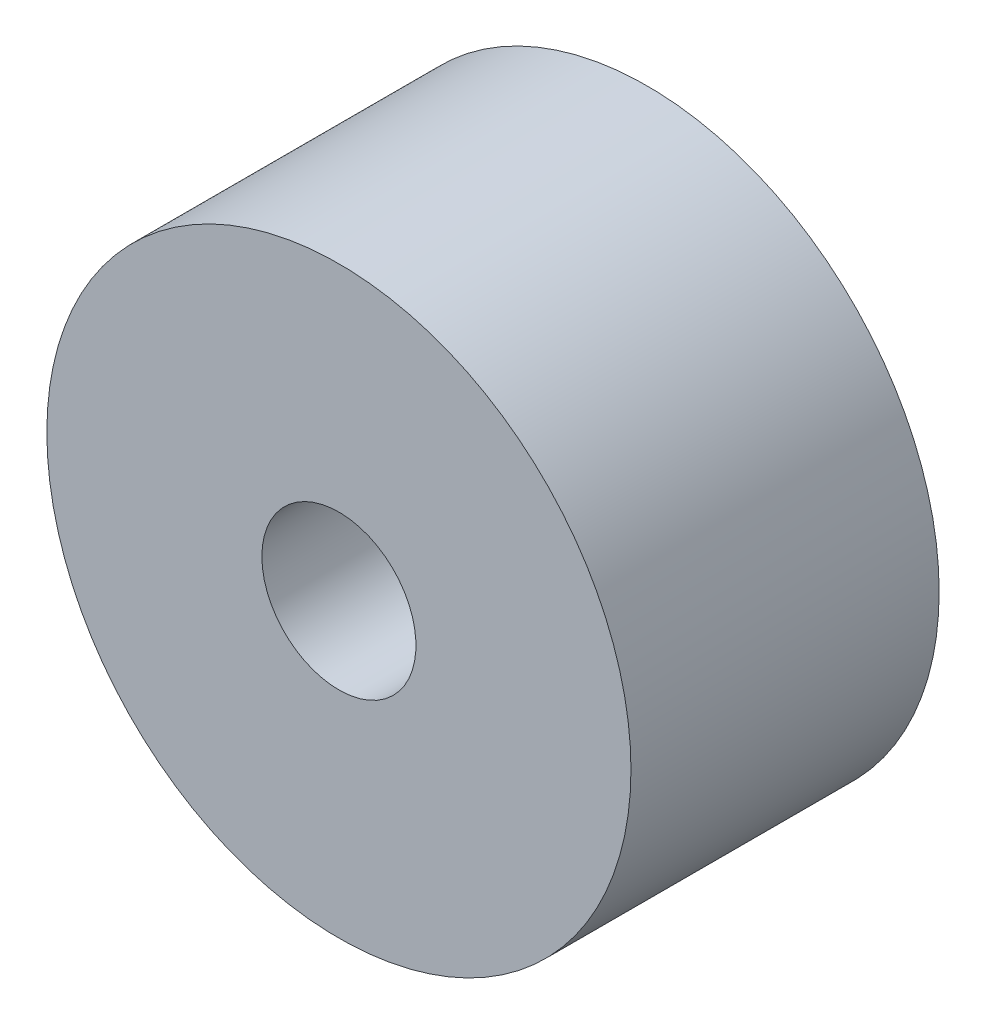
ISO-10303-21;
HEADER;
FILE_DESCRIPTION(('STEP AP214'),'2;1');
FILE_NAME('part.step','',(''),(''),'','','');
FILE_SCHEMA(('AUTOMOTIVE_DESIGN { 1 0 10303 214 1 1 1 1 }'));
ENDSEC;
DATA;
#1=APPLICATION_CONTEXT('core data for automotive mechanical design processes');
#2=APPLICATION_PROTOCOL_DEFINITION('international standard','automotive_design',2000,#1);
#3=PRODUCT_CONTEXT('',#1,'mechanical');
#4=PRODUCT('Part','Part','',(#3));
#5=PRODUCT_RELATED_PRODUCT_CATEGORY('part','',(#4));
#6=PRODUCT_DEFINITION_FORMATION('','',#4);
#7=PRODUCT_DEFINITION_CONTEXT('part definition',#1,'design');
#8=PRODUCT_DEFINITION('design','',#6,#7);
#9=PRODUCT_DEFINITION_SHAPE('','',#8);
#10=(LENGTH_UNIT() NAMED_UNIT(*) SI_UNIT(.MILLI.,.METRE.));
#11=(NAMED_UNIT(*) PLANE_ANGLE_UNIT() SI_UNIT($,.RADIAN.));
#12=(NAMED_UNIT(*) SI_UNIT($,.STERADIAN.) SOLID_ANGLE_UNIT());
#13=UNCERTAINTY_MEASURE_WITH_UNIT(LENGTH_MEASURE(1.E-05),#10,'distance_accuracy_value','');
#14=(GEOMETRIC_REPRESENTATION_CONTEXT(3) GLOBAL_UNCERTAINTY_ASSIGNED_CONTEXT((#13)) GLOBAL_UNIT_ASSIGNED_CONTEXT((#10,
#11,#12)) REPRESENTATION_CONTEXT('',''));
#15=CARTESIAN_POINT('',(0.,0.,0.));
#16=DIRECTION('',(0.,0.,1.));
#17=DIRECTION('',(1.,0.,0.));
#18=AXIS2_PLACEMENT_3D('',#15,#16,#17);
#19=CARTESIAN_POINT('',(0.,0.,0.));
#20=DIRECTION('',(0.,0.,1.));
#21=DIRECTION('',(1.,0.,0.));
#22=AXIS2_PLACEMENT_3D('',#19,#20,#21);
#23=PLANE('',#22);
#24=CARTESIAN_POINT('',(0.,0.,0.));
#25=DIRECTION('',(0.,0.,1.));
#26=DIRECTION('',(1.,0.,0.));
#27=AXIS2_PLACEMENT_3D('',#24,#25,#26);
#28=CIRCLE('',#27,4.64999999999999);
#29=CARTESIAN_POINT('',(4.64999999999999,0.,0.));
#30=VERTEX_POINT('',#29);
#31=EDGE_CURVE('E10',#30,#30,#28,.T.);
#32=ORIENTED_EDGE('',*,*,#31,.T.);
#33=EDGE_LOOP('',(#32));
#34=FACE_BOUND('',#33,.T.);
#35=CARTESIAN_POINT('',(0.,0.,0.));
#36=DIRECTION('',(0.,0.,1.));
#37=DIRECTION('',(1.,0.,0.));
#38=AXIS2_PLACEMENT_3D('',#35,#36,#37);
#39=CIRCLE('',#38,8.15);
#40=CARTESIAN_POINT('',(-8.15,0.,0.));
#41=VERTEX_POINT('',#40);
#42=EDGE_CURVE('E44',#41,#41,#39,.T.);
#43=ORIENTED_EDGE('',*,*,#42,.F.);
#44=EDGE_LOOP('',(#43));
#45=FACE_BOUND('',#44,.T.);
#46=ADVANCED_FACE('F32',(#34,#45),#23,.F.);
#47=CARTESIAN_POINT('',(0.,0.,8.6));
#48=DIRECTION('',(0.,0.,1.));
#49=DIRECTION('',(1.,0.,0.));
#50=AXIS2_PLACEMENT_3D('',#47,#48,#49);
#51=PLANE('',#50);
#52=CARTESIAN_POINT('',(0.,0.,8.6));
#53=DIRECTION('',(0.,0.,1.));
#54=DIRECTION('',(1.,0.,0.));
#55=AXIS2_PLACEMENT_3D('',#52,#53,#54);
#56=CIRCLE('',#55,8.15);
#57=CARTESIAN_POINT('',(-8.15,0.,8.6));
#58=VERTEX_POINT('',#57);
#59=EDGE_CURVE('E40',#58,#58,#56,.T.);
#60=ORIENTED_EDGE('',*,*,#59,.T.);
#61=EDGE_LOOP('',(#60));
#62=FACE_BOUND('',#61,.T.);
#63=CARTESIAN_POINT('',(0.,0.,8.6));
#64=DIRECTION('',(0.,0.,1.));
#65=DIRECTION('',(1.,0.,0.));
#66=AXIS2_PLACEMENT_3D('',#63,#64,#65);
#67=CIRCLE('',#66,2.15);
#68=CARTESIAN_POINT('',(-2.15,0.,8.6));
#69=VERTEX_POINT('',#68);
#70=EDGE_CURVE('E49',#69,#69,#67,.T.);
#71=ORIENTED_EDGE('',*,*,#70,.F.);
#72=EDGE_LOOP('',(#71));
#73=FACE_BOUND('',#72,.T.);
#74=ADVANCED_FACE('F75',(#62,#73),#51,.T.);
#75=CARTESIAN_POINT('',(0.,0.,8.6));
#76=DIRECTION('',(0.,0.,-1.));
#77=DIRECTION('',(-1.,0.,0.));
#78=AXIS2_PLACEMENT_3D('',#75,#76,#77);
#79=CYLINDRICAL_SURFACE('',#78,8.15);
#80=CARTESIAN_POINT('',(-8.15,0.,8.6));
#81=CARTESIAN_POINT('',(-8.15,0.,8.51041666666666));
#82=CARTESIAN_POINT('',(-8.15,0.,8.42083333333333));
#83=CARTESIAN_POINT('',(-8.15,0.,8.24166666666667));
#84=CARTESIAN_POINT('',(-8.15,0.,8.15208333333333));
#85=CARTESIAN_POINT('',(-8.15,0.,7.97291666666667));
#86=CARTESIAN_POINT('',(-8.15,0.,7.88333333333333));
#87=CARTESIAN_POINT('',(-8.15,0.,7.70416666666667));
#88=CARTESIAN_POINT('',(-8.15,0.,7.61458333333333));
#89=CARTESIAN_POINT('',(-8.15,0.,7.43541666666667));
#90=CARTESIAN_POINT('',(-8.15,0.,7.34583333333333));
#91=CARTESIAN_POINT('',(-8.15,0.,7.16666666666667));
#92=CARTESIAN_POINT('',(-8.15,0.,7.07708333333333));
#93=CARTESIAN_POINT('',(-8.15,0.,6.89791666666667));
#94=CARTESIAN_POINT('',(-8.15,0.,6.80833333333333));
#95=CARTESIAN_POINT('',(-8.15,0.,6.62916666666667));
#96=CARTESIAN_POINT('',(-8.15,0.,6.53958333333333));
#97=CARTESIAN_POINT('',(-8.15,0.,6.36041666666667));
#98=CARTESIAN_POINT('',(-8.15,0.,6.27083333333333));
#99=CARTESIAN_POINT('',(-8.15,0.,6.09166666666667));
#100=CARTESIAN_POINT('',(-8.15,0.,6.00208333333333));
#101=CARTESIAN_POINT('',(-8.15,0.,5.82291666666667));
#102=CARTESIAN_POINT('',(-8.15,0.,5.73333333333333));
#103=CARTESIAN_POINT('',(-8.15,0.,5.55416666666667));
#104=CARTESIAN_POINT('',(-8.15,0.,5.46458333333333));
#105=CARTESIAN_POINT('',(-8.15,0.,5.28541666666667));
#106=CARTESIAN_POINT('',(-8.15,0.,5.19583333333333));
#107=CARTESIAN_POINT('',(-8.15,0.,5.01666666666667));
#108=CARTESIAN_POINT('',(-8.15,0.,4.92708333333333));
#109=CARTESIAN_POINT('',(-8.15,0.,4.74791666666667));
#110=CARTESIAN_POINT('',(-8.15,0.,4.65833333333333));
#111=CARTESIAN_POINT('',(-8.15,0.,4.47916666666667));
#112=CARTESIAN_POINT('',(-8.15,0.,4.38958333333333));
#113=CARTESIAN_POINT('',(-8.15,0.,4.21041666666667));
#114=CARTESIAN_POINT('',(-8.15,0.,4.12083333333333));
#115=CARTESIAN_POINT('',(-8.15,0.,3.94166666666667));
#116=CARTESIAN_POINT('',(-8.15,0.,3.85208333333333));
#117=CARTESIAN_POINT('',(-8.15,0.,3.67291666666667));
#118=CARTESIAN_POINT('',(-8.15,0.,3.58333333333333));
#119=CARTESIAN_POINT('',(-8.15,0.,3.40416666666667));
#120=CARTESIAN_POINT('',(-8.15,0.,3.31458333333333));
#121=CARTESIAN_POINT('',(-8.15,0.,3.13541666666667));
#122=CARTESIAN_POINT('',(-8.15,0.,3.04583333333333));
#123=CARTESIAN_POINT('',(-8.15,0.,2.86666666666667));
#124=CARTESIAN_POINT('',(-8.15,0.,2.77708333333333));
#125=CARTESIAN_POINT('',(-8.15,0.,2.59791666666667));
#126=CARTESIAN_POINT('',(-8.15,0.,2.50833333333333));
#127=CARTESIAN_POINT('',(-8.15,0.,2.32916666666667));
#128=CARTESIAN_POINT('',(-8.15,0.,2.23958333333333));
#129=CARTESIAN_POINT('',(-8.15,0.,2.06041666666667));
#130=CARTESIAN_POINT('',(-8.15,0.,1.97083333333333));
#131=CARTESIAN_POINT('',(-8.15,0.,1.79166666666667));
#132=CARTESIAN_POINT('',(-8.15,0.,1.70208333333333));
#133=CARTESIAN_POINT('',(-8.15,0.,1.52291666666667));
#134=CARTESIAN_POINT('',(-8.15,0.,1.43333333333333));
#135=CARTESIAN_POINT('',(-8.15,0.,1.25416666666667));
#136=CARTESIAN_POINT('',(-8.15,0.,1.16458333333333));
#137=CARTESIAN_POINT('',(-8.15,0.,0.985416666666665));
#138=CARTESIAN_POINT('',(-8.15,0.,0.895833333333332));
#139=CARTESIAN_POINT('',(-8.15,0.,0.716666666666665));
#140=CARTESIAN_POINT('',(-8.15,0.,0.627083333333332));
#141=CARTESIAN_POINT('',(-8.15,0.,0.447916666666665));
#142=CARTESIAN_POINT('',(-8.15,0.,0.358333333333331));
#143=CARTESIAN_POINT('',(-8.15,0.,0.179166666666665));
#144=CARTESIAN_POINT('',(-8.15,0.,0.0895833333333315));
#145=CARTESIAN_POINT('',(-8.15,0.,0.));
#146=B_SPLINE_CURVE_WITH_KNOTS('',3,(#80,#81,#82,#83,#84,#85,#86,#87,#88,#89,#90,#91,#92,#93,
#94,#95,#96,#97,#98,#99,#100,#101,#102,#103,#104,#105,#106,#107,#108,#109,#110,#111,#112,#113,
#114,#115,#116,#117,#118,#119,#120,#121,#122,#123,#124,#125,#126,#127,#128,#129,#130,#131,#132,
#133,#134,#135,#136,#137,#138,#139,#140,#141,#142,#143,#144,#145),.UNSPECIFIED.,.F.,.F.,(4,2,2,
2,2,2,2,2,2,2,2,2,2,2,2,2,2,2,2,2,2,2,2,2,2,2,2,2,2,2,2,2,4),(0.,0.26875,0.5375,
0.806249999999999,1.075,1.34375,1.6125,1.88125,2.15,2.41875,2.6875,2.95625,3.225,3.49375,3.7625,
4.03125,4.3,4.56875,4.8375,5.10625,5.375,5.64375,5.9125,6.18125,6.45,6.71875,6.9875,7.25625,
7.525,7.79375,8.0625,8.33125,8.6),.UNSPECIFIED.);
#147=EDGE_CURVE('BSEAM71',#58,#41,#146,.T.);
#148=ORIENTED_EDGE('',*,*,#59,.F.);
#149=ORIENTED_EDGE('',*,*,#42,.T.);
#150=ORIENTED_EDGE('',*,*,#147,.T.);
#151=ORIENTED_EDGE('',*,*,#147,.F.);
#152=EDGE_LOOP('',(#148,#150,#149,#151));
#153=FACE_BOUND('',#152,.T.);
#154=ADVANCED_FACE('F71',(#153),#79,.T.);
#155=CARTESIAN_POINT('',(0.,0.,8.6));
#156=DIRECTION('',(0.,0.,-1.));
#157=DIRECTION('',(-1.,0.,0.));
#158=AXIS2_PLACEMENT_3D('',#155,#156,#157);
#159=CYLINDRICAL_SURFACE('',#158,2.15);
#160=CARTESIAN_POINT('',(0.,0.,-1.));
#161=DIRECTION('',(0.,0.,-1.));
#162=DIRECTION('',(-1.,0.,0.));
#163=AXIS2_PLACEMENT_3D('',#160,#161,#162);
#164=CIRCLE('',#163,2.15);
#165=CARTESIAN_POINT('',(-2.15,0.,-0.999999999999999));
#166=VERTEX_POINT('',#165);
#167=EDGE_CURVE('E56',#166,#166,#164,.T.);
#168=CARTESIAN_POINT('',(-2.15,0.,8.6));
#169=CARTESIAN_POINT('',(-2.15,0.,8.5));
#170=CARTESIAN_POINT('',(-2.15,0.,8.4));
#171=CARTESIAN_POINT('',(-2.15,0.,8.2));
#172=CARTESIAN_POINT('',(-2.15,0.,8.1));
#173=CARTESIAN_POINT('',(-2.15,0.,7.9));
#174=CARTESIAN_POINT('',(-2.15,0.,7.8));
#175=CARTESIAN_POINT('',(-2.15,0.,7.6));
#176=CARTESIAN_POINT('',(-2.15,0.,7.5));
#177=CARTESIAN_POINT('',(-2.15,0.,7.3));
#178=CARTESIAN_POINT('',(-2.15,0.,7.2));
#179=CARTESIAN_POINT('',(-2.15,0.,7.));
#180=CARTESIAN_POINT('',(-2.15,0.,6.9));
#181=CARTESIAN_POINT('',(-2.15,0.,6.7));
#182=CARTESIAN_POINT('',(-2.15,0.,6.6));
#183=CARTESIAN_POINT('',(-2.15,0.,6.4));
#184=CARTESIAN_POINT('',(-2.15,0.,6.3));
#185=CARTESIAN_POINT('',(-2.15,0.,6.1));
#186=CARTESIAN_POINT('',(-2.15,0.,6.));
#187=CARTESIAN_POINT('',(-2.15,0.,5.8));
#188=CARTESIAN_POINT('',(-2.15,0.,5.7));
#189=CARTESIAN_POINT('',(-2.15,0.,5.5));
#190=CARTESIAN_POINT('',(-2.15,0.,5.4));
#191=CARTESIAN_POINT('',(-2.15,0.,5.2));
#192=CARTESIAN_POINT('',(-2.15,0.,5.1));
#193=CARTESIAN_POINT('',(-2.15,0.,4.9));
#194=CARTESIAN_POINT('',(-2.15,0.,4.8));
#195=CARTESIAN_POINT('',(-2.15,0.,4.6));
#196=CARTESIAN_POINT('',(-2.15,0.,4.5));
#197=CARTESIAN_POINT('',(-2.15,0.,4.3));
#198=CARTESIAN_POINT('',(-2.15,0.,4.2));
#199=CARTESIAN_POINT('',(-2.15,0.,4.));
#200=CARTESIAN_POINT('',(-2.15,0.,3.9));
#201=CARTESIAN_POINT('',(-2.15,0.,3.7));
#202=CARTESIAN_POINT('',(-2.15,0.,3.6));
#203=CARTESIAN_POINT('',(-2.15,0.,3.4));
#204=CARTESIAN_POINT('',(-2.15,0.,3.3));
#205=CARTESIAN_POINT('',(-2.15,0.,3.1));
#206=CARTESIAN_POINT('',(-2.15,0.,3.));
#207=CARTESIAN_POINT('',(-2.15,0.,2.8));
#208=CARTESIAN_POINT('',(-2.15,0.,2.7));
#209=CARTESIAN_POINT('',(-2.15,0.,2.5));
#210=CARTESIAN_POINT('',(-2.15,0.,2.4));
#211=CARTESIAN_POINT('',(-2.15,0.,2.2));
#212=CARTESIAN_POINT('',(-2.15,0.,2.1));
#213=CARTESIAN_POINT('',(-2.15,0.,1.9));
#214=CARTESIAN_POINT('',(-2.15,0.,1.8));
#215=CARTESIAN_POINT('',(-2.15,0.,1.6));
#216=CARTESIAN_POINT('',(-2.15,0.,1.5));
#217=CARTESIAN_POINT('',(-2.15,0.,1.3));
#218=CARTESIAN_POINT('',(-2.15,0.,1.2));
#219=CARTESIAN_POINT('',(-2.15,0.,1.));
#220=CARTESIAN_POINT('',(-2.15,0.,0.9));
#221=CARTESIAN_POINT('',(-2.15,0.,0.7));
#222=CARTESIAN_POINT('',(-2.15,0.,0.6));
#223=CARTESIAN_POINT('',(-2.15,0.,0.400000000000001));
#224=CARTESIAN_POINT('',(-2.15,0.,0.3));
#225=CARTESIAN_POINT('',(-2.15,0.,0.100000000000001));
#226=CARTESIAN_POINT('',(-2.15,0.,0.));
#227=CARTESIAN_POINT('',(-2.15,0.,-0.199999999999999));
#228=CARTESIAN_POINT('',(-2.15,0.,-0.299999999999999));
#229=CARTESIAN_POINT('',(-2.15,0.,-0.499999999999999));
#230=CARTESIAN_POINT('',(-2.15,0.,-0.599999999999999));
#231=CARTESIAN_POINT('',(-2.15,0.,-0.799999999999999));
#232=CARTESIAN_POINT('',(-2.15,0.,-0.899999999999999));
#233=CARTESIAN_POINT('',(-2.15,0.,-0.999999999999999));
#234=B_SPLINE_CURVE_WITH_KNOTS('',3,(#168,#169,#170,#171,#172,#173,#174,#175,#176,#177,#178,
#179,#180,#181,#182,#183,#184,#185,#186,#187,#188,#189,#190,#191,#192,#193,#194,#195,#196,#197,
#198,#199,#200,#201,#202,#203,#204,#205,#206,#207,#208,#209,#210,#211,#212,#213,#214,#215,#216,
#217,#218,#219,#220,#221,#222,#223,#224,#225,#226,#227,#228,#229,#230,#231,#232,#233),
.UNSPECIFIED.,.F.,.F.,(4,2,2,2,2,2,2,2,2,2,2,2,2,2,2,2,2,2,2,2,2,2,2,2,2,2,2,2,2,2,2,2,4),(0.,
0.3,0.599999999999998,0.899999999999999,1.2,1.5,1.8,2.1,2.4,2.7,3.,3.3,3.6,3.9,4.2,4.5,4.8,5.1,
5.4,5.7,6.,6.3,6.6,6.9,7.2,7.5,7.8,8.1,8.4,8.7,9.,9.3,9.6),.UNSPECIFIED.);
#235=EDGE_CURVE('BSEAM60',#69,#166,#234,.T.);
#236=ORIENTED_EDGE('',*,*,#70,.T.);
#237=ORIENTED_EDGE('',*,*,#167,.T.);
#238=ORIENTED_EDGE('',*,*,#235,.T.);
#239=ORIENTED_EDGE('',*,*,#235,.F.);
#240=EDGE_LOOP('',(#236,#238,#237,#239));
#241=FACE_BOUND('',#240,.T.);
#242=ADVANCED_FACE('F60',(#241),#159,.F.);
#243=CARTESIAN_POINT('',(0.,0.,-1.));
#244=DIRECTION('',(0.,0.,-1.));
#245=DIRECTION('',(-1.,0.,0.));
#246=AXIS2_PLACEMENT_3D('',#243,#244,#245);
#247=PLANE('',#246);
#248=CARTESIAN_POINT('',(0.,0.,-1.));
#249=DIRECTION('',(0.,0.,-1.));
#250=DIRECTION('',(-1.,0.,0.));
#251=AXIS2_PLACEMENT_3D('',#248,#249,#250);
#252=CIRCLE('',#251,3.65);
#253=CARTESIAN_POINT('',(-3.65,0.,-1.));
#254=VERTEX_POINT('',#253);
#255=EDGE_CURVE('E53',#254,#254,#252,.T.);
#256=ORIENTED_EDGE('',*,*,#255,.T.);
#257=EDGE_LOOP('',(#256));
#258=FACE_BOUND('',#257,.T.);
#259=ORIENTED_EDGE('',*,*,#167,.F.);
#260=EDGE_LOOP('',(#259));
#261=FACE_BOUND('',#260,.T.);
#262=ADVANCED_FACE('F62',(#258,#261),#247,.T.);
#263=CARTESIAN_POINT('',(0.,0.,-0.999999999999998));
#264=DIRECTION('',(0.,0.,1.));
#265=DIRECTION('',(1.,0.,0.));
#266=AXIS2_PLACEMENT_3D('',#263,#264,#265);
#267=CONICAL_SURFACE('',#266,3.65,0.785398163397445);
#268=ORIENTED_EDGE('',*,*,#31,.F.);
#269=EDGE_LOOP('',(#268));
#270=FACE_BOUND('',#269,.T.);
#271=ORIENTED_EDGE('',*,*,#255,.F.);
#272=EDGE_LOOP('',(#271));
#273=FACE_BOUND('',#272,.T.);
#274=ADVANCED_FACE('F35',(#270,#273),#267,.T.);
#275=CLOSED_SHELL('',(#46,#74,#154,#242,#262,#274));
#276=MANIFOLD_SOLID_BREP('B2',#275);
#277=ADVANCED_BREP_SHAPE_REPRESENTATION('',(#18,#276),#14);
#278=SHAPE_DEFINITION_REPRESENTATION(#9,#277);
ENDSEC;
END-ISO-10303-21;
